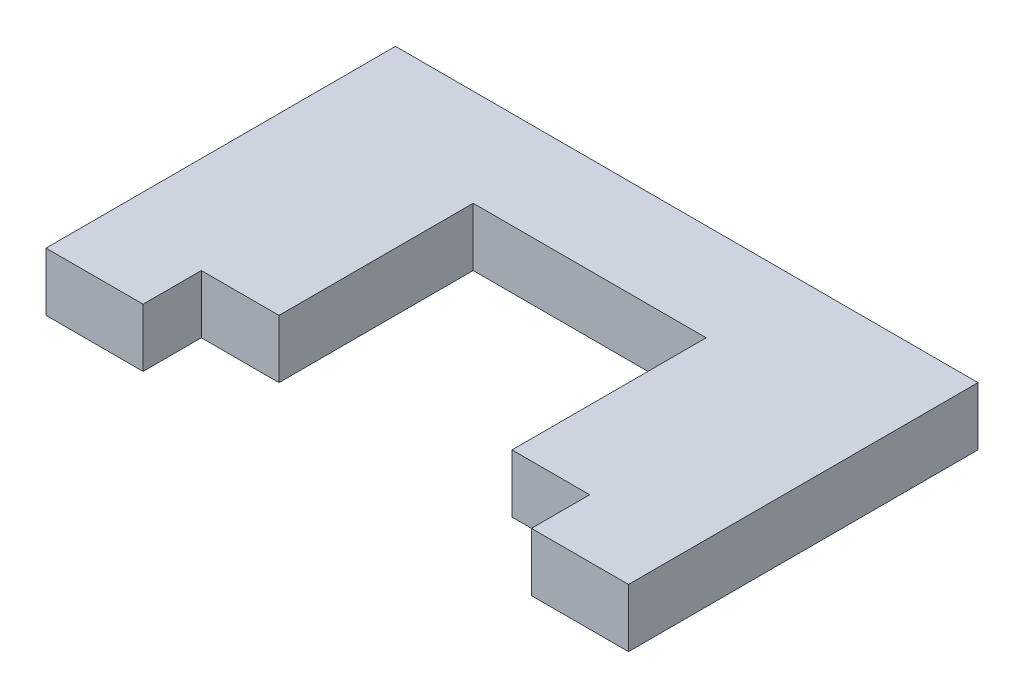
ISO-10303-21;
HEADER;
FILE_DESCRIPTION(('STEP AP214'),'2;1');
FILE_NAME('part.step','',(''),(''),'','','');
FILE_SCHEMA(('AUTOMOTIVE_DESIGN { 1 0 10303 214 1 1 1 1 }'));
ENDSEC;
DATA;
#1=APPLICATION_CONTEXT('core data for automotive mechanical design processes');
#2=APPLICATION_PROTOCOL_DEFINITION('international standard','automotive_design',2000,#1);
#3=PRODUCT_CONTEXT('',#1,'mechanical');
#4=PRODUCT('Part','Part','',(#3));
#5=PRODUCT_RELATED_PRODUCT_CATEGORY('part','',(#4));
#6=PRODUCT_DEFINITION_FORMATION('','',#4);
#7=PRODUCT_DEFINITION_CONTEXT('part definition',#1,'design');
#8=PRODUCT_DEFINITION('design','',#6,#7);
#9=PRODUCT_DEFINITION_SHAPE('','',#8);
#10=(LENGTH_UNIT() NAMED_UNIT(*) SI_UNIT(.MILLI.,.METRE.));
#11=(NAMED_UNIT(*) PLANE_ANGLE_UNIT() SI_UNIT($,.RADIAN.));
#12=(NAMED_UNIT(*) SI_UNIT($,.STERADIAN.) SOLID_ANGLE_UNIT());
#13=UNCERTAINTY_MEASURE_WITH_UNIT(LENGTH_MEASURE(1.E-05),#10,'distance_accuracy_value','');
#14=(GEOMETRIC_REPRESENTATION_CONTEXT(3) GLOBAL_UNCERTAINTY_ASSIGNED_CONTEXT((#13)) GLOBAL_UNIT_ASSIGNED_CONTEXT((#10,
#11,#12)) REPRESENTATION_CONTEXT('',''));
#15=CARTESIAN_POINT('',(0.,0.,0.));
#16=DIRECTION('',(0.,0.,1.));
#17=DIRECTION('',(1.,0.,0.));
#18=AXIS2_PLACEMENT_3D('',#15,#16,#17);
#19=CARTESIAN_POINT('',(0.,3.,6.));
#20=DIRECTION('',(0.,0.,-1.));
#21=DIRECTION('',(-1.,0.,0.));
#22=AXIS2_PLACEMENT_3D('',#19,#20,#21);
#23=PLANE('',#22);
#24=DIRECTION('',(1.,0.,0.));
#25=VECTOR('',#24,1.);
#26=CARTESIAN_POINT('',(0.,3.,6.));
#27=LINE('',#26,#25);
#28=CARTESIAN_POINT('',(6.,3.,6.));
#29=VERTEX_POINT('',#28);
#30=CARTESIAN_POINT('',(10.,3.,6.));
#31=VERTEX_POINT('',#30);
#32=EDGE_CURVE('E99',#29,#31,#27,.T.);
#33=ORIENTED_EDGE('',*,*,#32,.F.);
#34=DIRECTION('',(0.,1.,0.));
#35=VECTOR('',#34,1.);
#36=CARTESIAN_POINT('',(6.,0.,6.));
#37=LINE('',#36,#35);
#38=CARTESIAN_POINT('',(6.,0.,6.));
#39=VERTEX_POINT('',#38);
#40=EDGE_CURVE('E205',#39,#29,#37,.T.);
#41=ORIENTED_EDGE('',*,*,#40,.F.);
#42=DIRECTION('',(1.,0.,0.));
#43=VECTOR('',#42,1.);
#44=CARTESIAN_POINT('',(0.,0.,6.));
#45=LINE('',#44,#43);
#46=CARTESIAN_POINT('',(10.,0.,6.));
#47=VERTEX_POINT('',#46);
#48=EDGE_CURVE('E151',#39,#47,#45,.T.);
#49=ORIENTED_EDGE('',*,*,#48,.T.);
#50=DIRECTION('',(0.,-1.,0.));
#51=VECTOR('',#50,1.);
#52=CARTESIAN_POINT('',(10.,3.,6.));
#53=LINE('',#52,#51);
#54=EDGE_CURVE('E11',#31,#47,#53,.T.);
#55=ORIENTED_EDGE('',*,*,#54,.F.);
#56=EDGE_LOOP('',(#33,#41,#49,#55));
#57=FACE_BOUND('',#56,.T.);
#58=ADVANCED_FACE('F35',(#57),#23,.F.);
#59=CARTESIAN_POINT('',(-10.,0.,6.));
#60=VERTEX_POINT('',#59);
#61=CARTESIAN_POINT('',(-6.,0.,6.));
#62=VERTEX_POINT('',#61);
#63=EDGE_CURVE('E148',#60,#62,#45,.T.);
#64=ORIENTED_EDGE('',*,*,#63,.T.);
#65=DIRECTION('',(0.,1.,0.));
#66=VECTOR('',#65,1.);
#67=CARTESIAN_POINT('',(-6.,0.,6.));
#68=LINE('',#67,#66);
#69=CARTESIAN_POINT('',(-6.,3.,6.));
#70=VERTEX_POINT('',#69);
#71=EDGE_CURVE('E202',#62,#70,#68,.T.);
#72=ORIENTED_EDGE('',*,*,#71,.T.);
#73=CARTESIAN_POINT('',(-10.,3.,6.));
#74=VERTEX_POINT('',#73);
#75=EDGE_CURVE('E194',#74,#70,#27,.T.);
#76=ORIENTED_EDGE('',*,*,#75,.F.);
#77=DIRECTION('',(0.,-1.,0.));
#78=VECTOR('',#77,1.);
#79=CARTESIAN_POINT('',(-10.,3.,6.));
#80=LINE('',#79,#78);
#81=EDGE_CURVE('E59',#74,#60,#80,.T.);
#82=ORIENTED_EDGE('',*,*,#81,.T.);
#83=EDGE_LOOP('',(#64,#72,#76,#82));
#84=FACE_BOUND('',#83,.T.);
#85=ADVANCED_FACE('F37',(#84),#23,.F.);
#86=CARTESIAN_POINT('',(9.99999999999999,3.,0.));
#87=DIRECTION('',(1.,0.,0.));
#88=DIRECTION('',(0.,0.,-1.));
#89=AXIS2_PLACEMENT_3D('',#86,#87,#88);
#90=PLANE('',#89);
#91=DIRECTION('',(0.,0.,1.));
#92=VECTOR('',#91,1.);
#93=CARTESIAN_POINT('',(9.99999999999999,0.,0.));
#94=LINE('',#93,#92);
#95=CARTESIAN_POINT('',(10.,0.,9.));
#96=VERTEX_POINT('',#95);
#97=EDGE_CURVE('E150',#47,#96,#94,.T.);
#98=ORIENTED_EDGE('',*,*,#97,.T.);
#99=DIRECTION('',(0.,-1.,0.));
#100=VECTOR('',#99,1.);
#101=CARTESIAN_POINT('',(10.,3.,9.));
#102=LINE('',#101,#100);
#103=CARTESIAN_POINT('',(10.,3.,9.));
#104=VERTEX_POINT('',#103);
#105=EDGE_CURVE('E43',#104,#96,#102,.T.);
#106=ORIENTED_EDGE('',*,*,#105,.F.);
#107=DIRECTION('',(0.,0.,1.));
#108=VECTOR('',#107,1.);
#109=CARTESIAN_POINT('',(9.99999999999999,3.,0.));
#110=LINE('',#109,#108);
#111=EDGE_CURVE('E191',#31,#104,#110,.T.);
#112=ORIENTED_EDGE('',*,*,#111,.F.);
#113=ORIENTED_EDGE('',*,*,#54,.T.);
#114=EDGE_LOOP('',(#98,#106,#112,#113));
#115=FACE_BOUND('',#114,.T.);
#116=ADVANCED_FACE('F244',(#115),#90,.F.);
#117=CARTESIAN_POINT('',(0.,3.,9.));
#118=DIRECTION('',(0.,0.,-1.));
#119=DIRECTION('',(-1.,0.,0.));
#120=AXIS2_PLACEMENT_3D('',#117,#118,#119);
#121=PLANE('',#120);
#122=DIRECTION('',(1.,0.,0.));
#123=VECTOR('',#122,1.);
#124=CARTESIAN_POINT('',(0.,0.,9.));
#125=LINE('',#124,#123);
#126=CARTESIAN_POINT('',(15.,0.,9.));
#127=VERTEX_POINT('',#126);
#128=EDGE_CURVE('E153',#96,#127,#125,.T.);
#129=ORIENTED_EDGE('',*,*,#128,.T.);
#130=DIRECTION('',(0.,-1.,0.));
#131=VECTOR('',#130,1.);
#132=CARTESIAN_POINT('',(15.,3.,9.));
#133=LINE('',#132,#131);
#134=CARTESIAN_POINT('',(15.,3.,9.));
#135=VERTEX_POINT('',#134);
#136=EDGE_CURVE('E171',#135,#127,#133,.T.);
#137=ORIENTED_EDGE('',*,*,#136,.F.);
#138=DIRECTION('',(1.,0.,0.));
#139=VECTOR('',#138,1.);
#140=CARTESIAN_POINT('',(0.,3.,9.));
#141=LINE('',#140,#139);
#142=EDGE_CURVE('E137',#104,#135,#141,.T.);
#143=ORIENTED_EDGE('',*,*,#142,.F.);
#144=ORIENTED_EDGE('',*,*,#105,.T.);
#145=EDGE_LOOP('',(#129,#137,#143,#144));
#146=FACE_BOUND('',#145,.T.);
#147=ADVANCED_FACE('F178',(#146),#121,.F.);
#148=CARTESIAN_POINT('',(15.,3.,0.));
#149=DIRECTION('',(-1.,0.,0.));
#150=DIRECTION('',(0.,0.,1.));
#151=AXIS2_PLACEMENT_3D('',#148,#149,#150);
#152=PLANE('',#151);
#153=DIRECTION('',(0.,0.,-1.));
#154=VECTOR('',#153,1.);
#155=CARTESIAN_POINT('',(15.,0.,0.));
#156=LINE('',#155,#154);
#157=CARTESIAN_POINT('',(15.,0.,-9.));
#158=VERTEX_POINT('',#157);
#159=EDGE_CURVE('E155',#127,#158,#156,.T.);
#160=ORIENTED_EDGE('',*,*,#159,.T.);
#161=DIRECTION('',(0.,-1.,0.));
#162=VECTOR('',#161,1.);
#163=CARTESIAN_POINT('',(15.,3.,-9.));
#164=LINE('',#163,#162);
#165=CARTESIAN_POINT('',(15.,3.,-9.));
#166=VERTEX_POINT('',#165);
#167=EDGE_CURVE('E169',#166,#158,#164,.T.);
#168=ORIENTED_EDGE('',*,*,#167,.F.);
#169=DIRECTION('',(0.,0.,-1.));
#170=VECTOR('',#169,1.);
#171=CARTESIAN_POINT('',(15.,3.,0.));
#172=LINE('',#171,#170);
#173=EDGE_CURVE('E143',#135,#166,#172,.T.);
#174=ORIENTED_EDGE('',*,*,#173,.F.);
#175=ORIENTED_EDGE('',*,*,#136,.T.);
#176=EDGE_LOOP('',(#160,#168,#174,#175));
#177=FACE_BOUND('',#176,.T.);
#178=ADVANCED_FACE('F189',(#177),#152,.F.);
#179=CARTESIAN_POINT('',(0.,3.,-9.));
#180=DIRECTION('',(0.,0.,-1.));
#181=DIRECTION('',(-1.,0.,0.));
#182=AXIS2_PLACEMENT_3D('',#179,#180,#181);
#183=PLANE('',#182);
#184=DIRECTION('',(1.,0.,0.));
#185=VECTOR('',#184,1.);
#186=CARTESIAN_POINT('',(0.,0.,-9.));
#187=LINE('',#186,#185);
#188=CARTESIAN_POINT('',(-15.,0.,-9.));
#189=VERTEX_POINT('',#188);
#190=EDGE_CURVE('E159',#189,#158,#187,.T.);
#191=ORIENTED_EDGE('',*,*,#190,.F.);
#192=DIRECTION('',(0.,-1.,0.));
#193=VECTOR('',#192,1.);
#194=CARTESIAN_POINT('',(-15.,3.,-9.));
#195=LINE('',#194,#193);
#196=CARTESIAN_POINT('',(-15.,3.,-9.));
#197=VERTEX_POINT('',#196);
#198=EDGE_CURVE('E128',#197,#189,#195,.T.);
#199=ORIENTED_EDGE('',*,*,#198,.F.);
#200=DIRECTION('',(1.,0.,0.));
#201=VECTOR('',#200,1.);
#202=CARTESIAN_POINT('',(0.,3.,-9.));
#203=LINE('',#202,#201);
#204=EDGE_CURVE('E141',#197,#166,#203,.T.);
#205=ORIENTED_EDGE('',*,*,#204,.T.);
#206=ORIENTED_EDGE('',*,*,#167,.T.);
#207=EDGE_LOOP('',(#191,#199,#205,#206));
#208=FACE_BOUND('',#207,.T.);
#209=ADVANCED_FACE('F314',(#208),#183,.T.);
#210=CARTESIAN_POINT('',(-15.,3.,0.));
#211=DIRECTION('',(-1.,0.,0.));
#212=DIRECTION('',(0.,0.,1.));
#213=AXIS2_PLACEMENT_3D('',#210,#211,#212);
#214=PLANE('',#213);
#215=DIRECTION('',(0.,0.,-1.));
#216=VECTOR('',#215,1.);
#217=CARTESIAN_POINT('',(-15.,0.,0.));
#218=LINE('',#217,#216);
#219=CARTESIAN_POINT('',(-15.,0.,9.));
#220=VERTEX_POINT('',#219);
#221=EDGE_CURVE('E124',#220,#189,#218,.T.);
#222=ORIENTED_EDGE('',*,*,#221,.F.);
#223=DIRECTION('',(0.,-1.,0.));
#224=VECTOR('',#223,1.);
#225=CARTESIAN_POINT('',(-15.,3.,9.));
#226=LINE('',#225,#224);
#227=CARTESIAN_POINT('',(-15.,3.,9.));
#228=VERTEX_POINT('',#227);
#229=EDGE_CURVE('E118',#228,#220,#226,.T.);
#230=ORIENTED_EDGE('',*,*,#229,.F.);
#231=DIRECTION('',(0.,0.,-1.));
#232=VECTOR('',#231,1.);
#233=CARTESIAN_POINT('',(-15.,3.,0.));
#234=LINE('',#233,#232);
#235=EDGE_CURVE('E122',#228,#197,#234,.T.);
#236=ORIENTED_EDGE('',*,*,#235,.T.);
#237=ORIENTED_EDGE('',*,*,#198,.T.);
#238=EDGE_LOOP('',(#222,#230,#236,#237));
#239=FACE_BOUND('',#238,.T.);
#240=ADVANCED_FACE('F120',(#239),#214,.T.);
#241=CARTESIAN_POINT('',(-10.,0.,9.));
#242=VERTEX_POINT('',#241);
#243=EDGE_CURVE('E156',#220,#242,#125,.T.);
#244=ORIENTED_EDGE('',*,*,#243,.T.);
#245=DIRECTION('',(0.,-1.,0.));
#246=VECTOR('',#245,1.);
#247=CARTESIAN_POINT('',(-10.,3.,9.));
#248=LINE('',#247,#246);
#249=CARTESIAN_POINT('',(-10.,3.,9.));
#250=VERTEX_POINT('',#249);
#251=EDGE_CURVE('E129',#250,#242,#248,.T.);
#252=ORIENTED_EDGE('',*,*,#251,.F.);
#253=EDGE_CURVE('E132',#228,#250,#141,.T.);
#254=ORIENTED_EDGE('',*,*,#253,.F.);
#255=ORIENTED_EDGE('',*,*,#229,.T.);
#256=EDGE_LOOP('',(#244,#252,#254,#255));
#257=FACE_BOUND('',#256,.T.);
#258=ADVANCED_FACE('F133',(#257),#121,.F.);
#259=CARTESIAN_POINT('',(-10.,3.,0.));
#260=DIRECTION('',(1.,0.,0.));
#261=DIRECTION('',(0.,0.,-1.));
#262=AXIS2_PLACEMENT_3D('',#259,#260,#261);
#263=PLANE('',#262);
#264=DIRECTION('',(0.,0.,1.));
#265=VECTOR('',#264,1.);
#266=CARTESIAN_POINT('',(-10.,0.,0.));
#267=LINE('',#266,#265);
#268=EDGE_CURVE('E163',#60,#242,#267,.T.);
#269=ORIENTED_EDGE('',*,*,#268,.F.);
#270=ORIENTED_EDGE('',*,*,#81,.F.);
#271=DIRECTION('',(0.,0.,1.));
#272=VECTOR('',#271,1.);
#273=CARTESIAN_POINT('',(-10.,3.,0.));
#274=LINE('',#273,#272);
#275=EDGE_CURVE('E135',#74,#250,#274,.T.);
#276=ORIENTED_EDGE('',*,*,#275,.T.);
#277=ORIENTED_EDGE('',*,*,#251,.T.);
#278=EDGE_LOOP('',(#269,#270,#276,#277));
#279=FACE_BOUND('',#278,.T.);
#280=ADVANCED_FACE('F258',(#279),#263,.T.);
#281=CARTESIAN_POINT('',(0.,3.,0.));
#282=DIRECTION('',(0.,1.,0.));
#283=DIRECTION('',(0.,0.,1.));
#284=AXIS2_PLACEMENT_3D('',#281,#282,#283);
#285=PLANE('',#284);
#286=DIRECTION('',(0.,0.,-1.));
#287=VECTOR('',#286,1.);
#288=CARTESIAN_POINT('',(6.,3.,-4.));
#289=LINE('',#288,#287);
#290=CARTESIAN_POINT('',(6.,3.,-4.));
#291=VERTEX_POINT('',#290);
#292=EDGE_CURVE('E215',#29,#291,#289,.T.);
#293=ORIENTED_EDGE('',*,*,#292,.F.);
#294=ORIENTED_EDGE('',*,*,#32,.T.);
#295=ORIENTED_EDGE('',*,*,#111,.T.);
#296=ORIENTED_EDGE('',*,*,#142,.T.);
#297=ORIENTED_EDGE('',*,*,#173,.T.);
#298=ORIENTED_EDGE('',*,*,#204,.F.);
#299=ORIENTED_EDGE('',*,*,#235,.F.);
#300=ORIENTED_EDGE('',*,*,#253,.T.);
#301=ORIENTED_EDGE('',*,*,#275,.F.);
#302=ORIENTED_EDGE('',*,*,#75,.T.);
#303=DIRECTION('',(0.,0.,1.));
#304=VECTOR('',#303,1.);
#305=CARTESIAN_POINT('',(-6.,3.,-4.));
#306=LINE('',#305,#304);
#307=CARTESIAN_POINT('',(-6.,3.,-4.));
#308=VERTEX_POINT('',#307);
#309=EDGE_CURVE('E208',#308,#70,#306,.T.);
#310=ORIENTED_EDGE('',*,*,#309,.F.);
#311=DIRECTION('',(-1.,0.,0.));
#312=VECTOR('',#311,1.);
#313=CARTESIAN_POINT('',(-6.,3.,-4.));
#314=LINE('',#313,#312);
#315=EDGE_CURVE('E212',#291,#308,#314,.T.);
#316=ORIENTED_EDGE('',*,*,#315,.F.);
#317=EDGE_LOOP('',(#293,#294,#295,#296,#297,#298,#299,#300,#301,#302,#310,#316));
#318=FACE_BOUND('',#317,.T.);
#319=ADVANCED_FACE('F139',(#318),#285,.T.);
#320=CARTESIAN_POINT('',(0.,0.,0.));
#321=DIRECTION('',(0.,1.,0.));
#322=DIRECTION('',(0.,0.,1.));
#323=AXIS2_PLACEMENT_3D('',#320,#321,#322);
#324=PLANE('',#323);
#325=ORIENTED_EDGE('',*,*,#48,.F.);
#326=DIRECTION('',(0.,0.,-1.));
#327=VECTOR('',#326,1.);
#328=CARTESIAN_POINT('',(6.,0.,-4.));
#329=LINE('',#328,#327);
#330=CARTESIAN_POINT('',(6.,0.,-4.));
#331=VERTEX_POINT('',#330);
#332=EDGE_CURVE('E211',#39,#331,#329,.T.);
#333=ORIENTED_EDGE('',*,*,#332,.T.);
#334=DIRECTION('',(-1.,0.,0.));
#335=VECTOR('',#334,1.);
#336=CARTESIAN_POINT('',(-6.,0.,-4.));
#337=LINE('',#336,#335);
#338=CARTESIAN_POINT('',(-6.,0.,-4.));
#339=VERTEX_POINT('',#338);
#340=EDGE_CURVE('E219',#331,#339,#337,.T.);
#341=ORIENTED_EDGE('',*,*,#340,.T.);
#342=DIRECTION('',(0.,0.,1.));
#343=VECTOR('',#342,1.);
#344=CARTESIAN_POINT('',(-6.,0.,-4.));
#345=LINE('',#344,#343);
#346=EDGE_CURVE('E50',#339,#62,#345,.T.);
#347=ORIENTED_EDGE('',*,*,#346,.T.);
#348=ORIENTED_EDGE('',*,*,#63,.F.);
#349=ORIENTED_EDGE('',*,*,#268,.T.);
#350=ORIENTED_EDGE('',*,*,#243,.F.);
#351=ORIENTED_EDGE('',*,*,#221,.T.);
#352=ORIENTED_EDGE('',*,*,#190,.T.);
#353=ORIENTED_EDGE('',*,*,#159,.F.);
#354=ORIENTED_EDGE('',*,*,#128,.F.);
#355=ORIENTED_EDGE('',*,*,#97,.F.);
#356=EDGE_LOOP('',(#325,#333,#341,#347,#348,#349,#350,#351,#352,#353,#354,#355));
#357=FACE_BOUND('',#356,.T.);
#358=ADVANCED_FACE('F185',(#357),#324,.F.);
#359=CARTESIAN_POINT('',(6.,0.,-4.));
#360=DIRECTION('',(1.,0.,0.));
#361=DIRECTION('',(0.,0.,-1.));
#362=AXIS2_PLACEMENT_3D('',#359,#360,#361);
#363=PLANE('',#362);
#364=ORIENTED_EDGE('',*,*,#292,.T.);
#365=DIRECTION('',(0.,1.,0.));
#366=VECTOR('',#365,1.);
#367=CARTESIAN_POINT('',(6.,0.,-4.));
#368=LINE('',#367,#366);
#369=EDGE_CURVE('E197',#331,#291,#368,.T.);
#370=ORIENTED_EDGE('',*,*,#369,.F.);
#371=ORIENTED_EDGE('',*,*,#332,.F.);
#372=ORIENTED_EDGE('',*,*,#40,.T.);
#373=EDGE_LOOP('',(#364,#370,#371,#372));
#374=FACE_BOUND('',#373,.T.);
#375=ADVANCED_FACE('F231',(#374),#363,.F.);
#376=CARTESIAN_POINT('',(-6.,0.,-4.));
#377=DIRECTION('',(-1.,0.,0.));
#378=DIRECTION('',(0.,0.,1.));
#379=AXIS2_PLACEMENT_3D('',#376,#377,#378);
#380=PLANE('',#379);
#381=ORIENTED_EDGE('',*,*,#309,.T.);
#382=ORIENTED_EDGE('',*,*,#71,.F.);
#383=ORIENTED_EDGE('',*,*,#346,.F.);
#384=DIRECTION('',(0.,1.,0.));
#385=VECTOR('',#384,1.);
#386=CARTESIAN_POINT('',(-6.,0.,-4.));
#387=LINE('',#386,#385);
#388=EDGE_CURVE('E200',#339,#308,#387,.T.);
#389=ORIENTED_EDGE('',*,*,#388,.T.);
#390=EDGE_LOOP('',(#381,#382,#383,#389));
#391=FACE_BOUND('',#390,.T.);
#392=ADVANCED_FACE('F242',(#391),#380,.F.);
#393=CARTESIAN_POINT('',(-6.,0.,-4.));
#394=DIRECTION('',(0.,0.,-1.));
#395=DIRECTION('',(-1.,0.,0.));
#396=AXIS2_PLACEMENT_3D('',#393,#394,#395);
#397=PLANE('',#396);
#398=ORIENTED_EDGE('',*,*,#315,.T.);
#399=ORIENTED_EDGE('',*,*,#388,.F.);
#400=ORIENTED_EDGE('',*,*,#340,.F.);
#401=ORIENTED_EDGE('',*,*,#369,.T.);
#402=EDGE_LOOP('',(#398,#399,#400,#401));
#403=FACE_BOUND('',#402,.T.);
#404=ADVANCED_FACE('F295',(#403),#397,.F.);
#405=CLOSED_SHELL('',(#58,#85,#116,#147,#178,#209,#240,#258,#280,#319,#358,#375,#392,#404));
#406=MANIFOLD_SOLID_BREP('B2',#405);
#407=ADVANCED_BREP_SHAPE_REPRESENTATION('',(#18,#406),#14);
#408=SHAPE_DEFINITION_REPRESENTATION(#9,#407);
ENDSEC;
END-ISO-10303-21;
